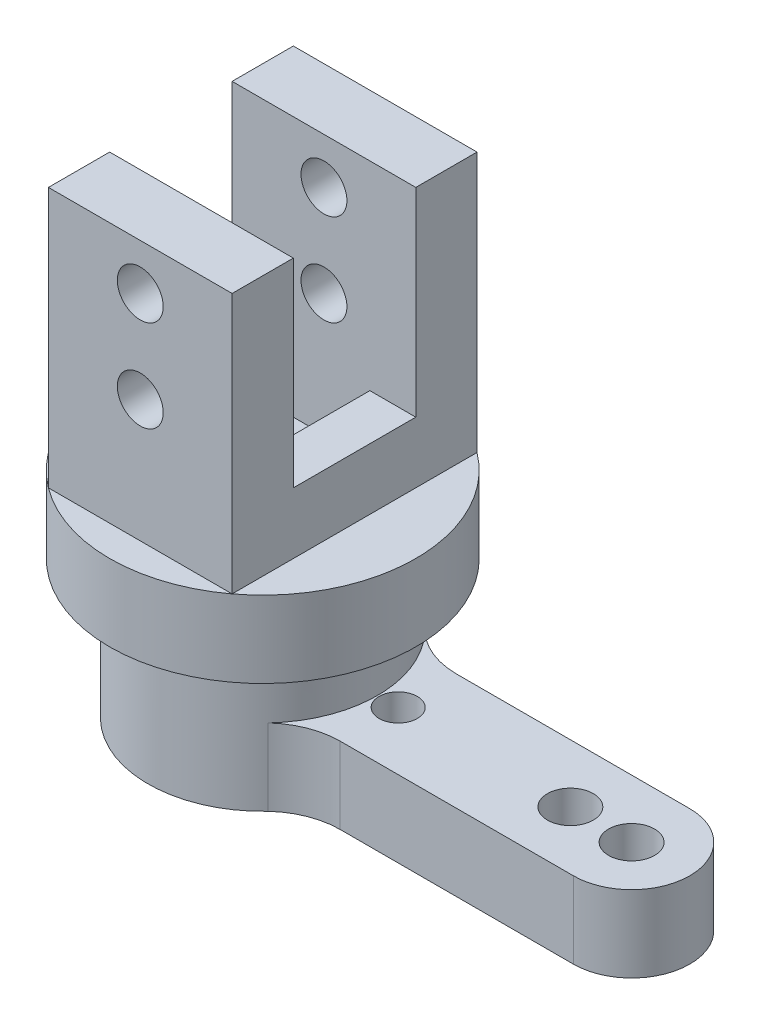
ISO-10303-21;
HEADER;
FILE_DESCRIPTION(('STEP AP214'),'2;1');
FILE_NAME('part.step','',(''),(''),'','','');
FILE_SCHEMA(('AUTOMOTIVE_DESIGN { 1 0 10303 214 1 1 1 1 }'));
ENDSEC;
DATA;
#1=APPLICATION_CONTEXT('core data for automotive mechanical design processes');
#2=APPLICATION_PROTOCOL_DEFINITION('international standard','automotive_design',2000,#1);
#3=PRODUCT_CONTEXT('',#1,'mechanical');
#4=PRODUCT('Part','Part','',(#3));
#5=PRODUCT_RELATED_PRODUCT_CATEGORY('part','',(#4));
#6=PRODUCT_DEFINITION_FORMATION('','',#4);
#7=PRODUCT_DEFINITION_CONTEXT('part definition',#1,'design');
#8=PRODUCT_DEFINITION('design','',#6,#7);
#9=PRODUCT_DEFINITION_SHAPE('','',#8);
#10=(LENGTH_UNIT() NAMED_UNIT(*) SI_UNIT(.MILLI.,.METRE.));
#11=(NAMED_UNIT(*) PLANE_ANGLE_UNIT() SI_UNIT($,.RADIAN.));
#12=(NAMED_UNIT(*) SI_UNIT($,.STERADIAN.) SOLID_ANGLE_UNIT());
#13=UNCERTAINTY_MEASURE_WITH_UNIT(LENGTH_MEASURE(1.E-05),#10,'distance_accuracy_value','');
#14=(GEOMETRIC_REPRESENTATION_CONTEXT(3) GLOBAL_UNCERTAINTY_ASSIGNED_CONTEXT((#13)) GLOBAL_UNIT_ASSIGNED_CONTEXT((#10,
#11,#12)) REPRESENTATION_CONTEXT('',''));
#15=CARTESIAN_POINT('',(0.,0.,0.));
#16=DIRECTION('',(0.,0.,1.));
#17=DIRECTION('',(1.,0.,0.));
#18=AXIS2_PLACEMENT_3D('',#15,#16,#17);
#19=CARTESIAN_POINT('',(0.,31.,8.));
#20=DIRECTION('',(0.,0.,-1.));
#21=DIRECTION('',(-1.,0.,0.));
#22=AXIS2_PLACEMENT_3D('',#19,#20,#21);
#23=PLANE('',#22);
#24=CARTESIAN_POINT('',(0.,28.,8.));
#25=DIRECTION('',(0.,0.,1.));
#26=DIRECTION('',(1.,0.,0.));
#27=AXIS2_PLACEMENT_3D('',#24,#25,#26);
#28=CIRCLE('',#27,1.5);
#29=CARTESIAN_POINT('',(1.5,28.,8.));
#30=VERTEX_POINT('',#29);
#31=EDGE_CURVE('E763',#30,#30,#28,.T.);
#32=ORIENTED_EDGE('',*,*,#31,.F.);
#33=EDGE_LOOP('',(#32));
#34=FACE_BOUND('',#33,.T.);
#35=DIRECTION('',(1.,0.,0.));
#36=VECTOR('',#35,1.);
#37=CARTESIAN_POINT('',(0.,14.,8.));
#38=LINE('',#37,#36);
#39=CARTESIAN_POINT('',(-6.,14.,8.));
#40=VERTEX_POINT('',#39);
#41=CARTESIAN_POINT('',(6.,14.,8.));
#42=VERTEX_POINT('',#41);
#43=EDGE_CURVE('E357',#40,#42,#38,.T.);
#44=ORIENTED_EDGE('',*,*,#43,.T.);
#45=DIRECTION('',(0.,-1.,0.));
#46=VECTOR('',#45,1.);
#47=CARTESIAN_POINT('',(6.,31.,8.));
#48=LINE('',#47,#46);
#49=CARTESIAN_POINT('',(6.,31.,8.));
#50=VERTEX_POINT('',#49);
#51=EDGE_CURVE('E187',#50,#42,#48,.T.);
#52=ORIENTED_EDGE('',*,*,#51,.F.);
#53=DIRECTION('',(1.,0.,0.));
#54=VECTOR('',#53,1.);
#55=CARTESIAN_POINT('',(0.,31.,8.));
#56=LINE('',#55,#54);
#57=CARTESIAN_POINT('',(-6.,31.,8.));
#58=VERTEX_POINT('',#57);
#59=EDGE_CURVE('E350',#58,#50,#56,.T.);
#60=ORIENTED_EDGE('',*,*,#59,.F.);
#61=DIRECTION('',(0.,-1.,0.));
#62=VECTOR('',#61,1.);
#63=CARTESIAN_POINT('',(-6.,31.,8.));
#64=LINE('',#63,#62);
#65=EDGE_CURVE('E191',#58,#40,#64,.T.);
#66=ORIENTED_EDGE('',*,*,#65,.T.);
#67=EDGE_LOOP('',(#44,#52,#60,#66));
#68=FACE_BOUND('',#67,.T.);
#69=CARTESIAN_POINT('',(0.,22.,8.));
#70=DIRECTION('',(0.,0.,1.));
#71=DIRECTION('',(1.,0.,0.));
#72=AXIS2_PLACEMENT_3D('',#69,#70,#71);
#73=CIRCLE('',#72,1.5);
#74=CARTESIAN_POINT('',(1.5,22.,8.));
#75=VERTEX_POINT('',#74);
#76=EDGE_CURVE('E280',#75,#75,#73,.T.);
#77=ORIENTED_EDGE('',*,*,#76,.F.);
#78=EDGE_LOOP('',(#77));
#79=FACE_BOUND('',#78,.T.);
#80=ADVANCED_FACE('F34',(#34,#68,#79),#23,.F.);
#81=CARTESIAN_POINT('',(0.,14.,0.));
#82=DIRECTION('',(0.,1.,0.));
#83=DIRECTION('',(0.,0.,1.));
#84=AXIS2_PLACEMENT_3D('',#81,#82,#83);
#85=PLANE('',#84);
#86=CARTESIAN_POINT('',(0.,14.,0.));
#87=DIRECTION('',(0.,1.,0.));
#88=DIRECTION('',(0.,0.,1.));
#89=AXIS2_PLACEMENT_3D('',#86,#87,#88);
#90=CIRCLE('',#89,1.5);
#91=CARTESIAN_POINT('',(0.,14.,1.5));
#92=VERTEX_POINT('',#91);
#93=EDGE_CURVE('E199',#92,#92,#90,.T.);
#94=ORIENTED_EDGE('',*,*,#93,.F.);
#95=EDGE_LOOP('',(#94));
#96=FACE_BOUND('',#95,.T.);
#97=DIRECTION('',(-1.,0.,0.));
#98=VECTOR('',#97,1.);
#99=CARTESIAN_POINT('',(0.,14.,-4.));
#100=LINE('',#99,#98);
#101=CARTESIAN_POINT('',(3.,14.,-4.));
#102=VERTEX_POINT('',#101);
#103=CARTESIAN_POINT('',(-3.,14.,-4.));
#104=VERTEX_POINT('',#103);
#105=EDGE_CURVE('E321',#102,#104,#100,.T.);
#106=ORIENTED_EDGE('',*,*,#105,.T.);
#107=DIRECTION('',(0.,0.,-1.));
#108=VECTOR('',#107,1.);
#109=CARTESIAN_POINT('',(-3.,14.,-4.));
#110=LINE('',#109,#108);
#111=CARTESIAN_POINT('',(-3.,14.,4.));
#112=VERTEX_POINT('',#111);
#113=EDGE_CURVE('E59',#112,#104,#110,.T.);
#114=ORIENTED_EDGE('',*,*,#113,.F.);
#115=DIRECTION('',(-1.,0.,0.));
#116=VECTOR('',#115,1.);
#117=CARTESIAN_POINT('',(0.,14.,4.));
#118=LINE('',#117,#116);
#119=CARTESIAN_POINT('',(3.,14.,4.));
#120=VERTEX_POINT('',#119);
#121=EDGE_CURVE('E351',#120,#112,#118,.T.);
#122=ORIENTED_EDGE('',*,*,#121,.F.);
#123=DIRECTION('',(0.,0.,1.));
#124=VECTOR('',#123,1.);
#125=CARTESIAN_POINT('',(3.,14.,-4.));
#126=LINE('',#125,#124);
#127=EDGE_CURVE('E182',#102,#120,#126,.T.);
#128=ORIENTED_EDGE('',*,*,#127,.F.);
#129=EDGE_LOOP('',(#106,#114,#122,#128));
#130=FACE_BOUND('',#129,.T.);
#131=ADVANCED_FACE('F407',(#96,#130),#85,.T.);
#132=DIRECTION('',(0.,0.,-1.));
#133=VECTOR('',#132,1.);
#134=CARTESIAN_POINT('',(-6.,14.,0.));
#135=LINE('',#134,#133);
#136=CARTESIAN_POINT('',(-6.,14.,-8.));
#137=VERTEX_POINT('',#136);
#138=EDGE_CURVE('E346',#40,#137,#135,.T.);
#139=ORIENTED_EDGE('',*,*,#138,.T.);
#140=CARTESIAN_POINT('',(0.,14.,0.));
#141=DIRECTION('',(0.,1.,0.));
#142=DIRECTION('',(0.,0.,1.));
#143=AXIS2_PLACEMENT_3D('',#140,#141,#142);
#144=CIRCLE('',#143,10.);
#145=EDGE_CURVE('E211',#137,#40,#144,.T.);
#146=ORIENTED_EDGE('',*,*,#145,.T.);
#147=EDGE_LOOP('',(#139,#146));
#148=FACE_BOUND('',#147,.T.);
#149=ADVANCED_FACE('F409',(#148),#85,.T.);
#150=CARTESIAN_POINT('',(0.,31.,4.));
#151=DIRECTION('',(0.,0.,1.));
#152=DIRECTION('',(1.,0.,0.));
#153=AXIS2_PLACEMENT_3D('',#150,#151,#152);
#154=PLANE('',#153);
#155=CARTESIAN_POINT('',(0.,28.,4.));
#156=DIRECTION('',(0.,0.,1.));
#157=DIRECTION('',(1.,0.,0.));
#158=AXIS2_PLACEMENT_3D('',#155,#156,#157);
#159=CIRCLE('',#158,1.5);
#160=CARTESIAN_POINT('',(1.5,28.,4.));
#161=VERTEX_POINT('',#160);
#162=EDGE_CURVE('E287',#161,#161,#159,.T.);
#163=ORIENTED_EDGE('',*,*,#162,.T.);
#164=EDGE_LOOP('',(#163));
#165=FACE_BOUND('',#164,.T.);
#166=CARTESIAN_POINT('',(0.,22.,4.));
#167=DIRECTION('',(0.,0.,1.));
#168=DIRECTION('',(1.,0.,0.));
#169=AXIS2_PLACEMENT_3D('',#166,#167,#168);
#170=CIRCLE('',#169,1.5);
#171=CARTESIAN_POINT('',(1.5,22.,4.));
#172=VERTEX_POINT('',#171);
#173=EDGE_CURVE('E284',#172,#172,#170,.T.);
#174=ORIENTED_EDGE('',*,*,#173,.T.);
#175=EDGE_LOOP('',(#174));
#176=FACE_BOUND('',#175,.T.);
#177=DIRECTION('',(0.,-1.,0.));
#178=VECTOR('',#177,1.);
#179=CARTESIAN_POINT('',(-3.,18.,4.));
#180=LINE('',#179,#178);
#181=CARTESIAN_POINT('',(-3.,18.,4.));
#182=VERTEX_POINT('',#181);
#183=EDGE_CURVE('E51',#182,#112,#180,.T.);
#184=ORIENTED_EDGE('',*,*,#183,.F.);
#185=DIRECTION('',(1.,0.,0.));
#186=VECTOR('',#185,1.);
#187=CARTESIAN_POINT('',(-6.,18.,4.));
#188=LINE('',#187,#186);
#189=CARTESIAN_POINT('',(-6.,18.,4.));
#190=VERTEX_POINT('',#189);
#191=EDGE_CURVE('E298',#190,#182,#188,.T.);
#192=ORIENTED_EDGE('',*,*,#191,.F.);
#193=DIRECTION('',(0.,-1.,0.));
#194=VECTOR('',#193,1.);
#195=CARTESIAN_POINT('',(-6.,31.,4.));
#196=LINE('',#195,#194);
#197=CARTESIAN_POINT('',(-6.,31.,4.));
#198=VERTEX_POINT('',#197);
#199=EDGE_CURVE('E188',#198,#190,#196,.T.);
#200=ORIENTED_EDGE('',*,*,#199,.F.);
#201=DIRECTION('',(-1.,0.,0.));
#202=VECTOR('',#201,1.);
#203=CARTESIAN_POINT('',(0.,31.,4.));
#204=LINE('',#203,#202);
#205=CARTESIAN_POINT('',(6.,31.,4.));
#206=VERTEX_POINT('',#205);
#207=EDGE_CURVE('E186',#206,#198,#204,.T.);
#208=ORIENTED_EDGE('',*,*,#207,.F.);
#209=DIRECTION('',(0.,-1.,0.));
#210=VECTOR('',#209,1.);
#211=CARTESIAN_POINT('',(6.,31.,4.));
#212=LINE('',#211,#210);
#213=CARTESIAN_POINT('',(6.,18.,4.));
#214=VERTEX_POINT('',#213);
#215=EDGE_CURVE('E167',#206,#214,#212,.T.);
#216=ORIENTED_EDGE('',*,*,#215,.T.);
#217=DIRECTION('',(1.,0.,0.));
#218=VECTOR('',#217,1.);
#219=CARTESIAN_POINT('',(6.,18.,4.));
#220=LINE('',#219,#218);
#221=CARTESIAN_POINT('',(3.,18.,4.));
#222=VERTEX_POINT('',#221);
#223=EDGE_CURVE('E174',#222,#214,#220,.T.);
#224=ORIENTED_EDGE('',*,*,#223,.F.);
#225=DIRECTION('',(0.,-1.,0.));
#226=VECTOR('',#225,1.);
#227=CARTESIAN_POINT('',(3.,18.,4.));
#228=LINE('',#227,#226);
#229=EDGE_CURVE('E316',#222,#120,#228,.T.);
#230=ORIENTED_EDGE('',*,*,#229,.T.);
#231=ORIENTED_EDGE('',*,*,#121,.T.);
#232=EDGE_LOOP('',(#184,#192,#200,#208,#216,#224,#230,#231));
#233=FACE_BOUND('',#232,.T.);
#234=ADVANCED_FACE('F184',(#165,#176,#233),#154,.F.);
#235=CARTESIAN_POINT('',(0.,31.,-4.));
#236=DIRECTION('',(0.,0.,1.));
#237=DIRECTION('',(1.,0.,0.));
#238=AXIS2_PLACEMENT_3D('',#235,#236,#237);
#239=PLANE('',#238);
#240=CARTESIAN_POINT('',(0.,28.,-4.));
#241=DIRECTION('',(0.,0.,1.));
#242=DIRECTION('',(1.,0.,0.));
#243=AXIS2_PLACEMENT_3D('',#240,#241,#242);
#244=CIRCLE('',#243,1.5);
#245=CARTESIAN_POINT('',(1.5,28.,-4.));
#246=VERTEX_POINT('',#245);
#247=EDGE_CURVE('E292',#246,#246,#244,.T.);
#248=ORIENTED_EDGE('',*,*,#247,.F.);
#249=EDGE_LOOP('',(#248));
#250=FACE_BOUND('',#249,.T.);
#251=CARTESIAN_POINT('',(0.,22.,-4.));
#252=DIRECTION('',(0.,0.,1.));
#253=DIRECTION('',(1.,0.,0.));
#254=AXIS2_PLACEMENT_3D('',#251,#252,#253);
#255=CIRCLE('',#254,1.5);
#256=CARTESIAN_POINT('',(1.5,22.,-4.));
#257=VERTEX_POINT('',#256);
#258=EDGE_CURVE('E279',#257,#257,#255,.T.);
#259=ORIENTED_EDGE('',*,*,#258,.F.);
#260=EDGE_LOOP('',(#259));
#261=FACE_BOUND('',#260,.T.);
#262=DIRECTION('',(-1.,0.,0.));
#263=VECTOR('',#262,1.);
#264=CARTESIAN_POINT('',(-6.,18.,-4.));
#265=LINE('',#264,#263);
#266=CARTESIAN_POINT('',(-3.,18.,-4.));
#267=VERTEX_POINT('',#266);
#268=CARTESIAN_POINT('',(-6.,18.,-4.));
#269=VERTEX_POINT('',#268);
#270=EDGE_CURVE('E304',#267,#269,#265,.T.);
#271=ORIENTED_EDGE('',*,*,#270,.F.);
#272=DIRECTION('',(0.,-1.,0.));
#273=VECTOR('',#272,1.);
#274=CARTESIAN_POINT('',(-3.,18.,-4.));
#275=LINE('',#274,#273);
#276=EDGE_CURVE('E310',#267,#104,#275,.T.);
#277=ORIENTED_EDGE('',*,*,#276,.T.);
#278=ORIENTED_EDGE('',*,*,#105,.F.);
#279=DIRECTION('',(0.,-1.,0.));
#280=VECTOR('',#279,1.);
#281=CARTESIAN_POINT('',(3.,18.,-4.));
#282=LINE('',#281,#280);
#283=CARTESIAN_POINT('',(3.,18.,-4.));
#284=VERTEX_POINT('',#283);
#285=EDGE_CURVE('E319',#284,#102,#282,.T.);
#286=ORIENTED_EDGE('',*,*,#285,.F.);
#287=DIRECTION('',(-1.,0.,0.));
#288=VECTOR('',#287,1.);
#289=CARTESIAN_POINT('',(6.,18.,-4.));
#290=LINE('',#289,#288);
#291=CARTESIAN_POINT('',(6.,18.,-4.));
#292=VERTEX_POINT('',#291);
#293=EDGE_CURVE('E173',#292,#284,#290,.T.);
#294=ORIENTED_EDGE('',*,*,#293,.F.);
#295=DIRECTION('',(0.,-1.,0.));
#296=VECTOR('',#295,1.);
#297=CARTESIAN_POINT('',(6.,31.,-4.));
#298=LINE('',#297,#296);
#299=CARTESIAN_POINT('',(6.,31.,-4.));
#300=VERTEX_POINT('',#299);
#301=EDGE_CURVE('E170',#300,#292,#298,.T.);
#302=ORIENTED_EDGE('',*,*,#301,.F.);
#303=DIRECTION('',(-1.,0.,0.));
#304=VECTOR('',#303,1.);
#305=CARTESIAN_POINT('',(0.,31.,-4.));
#306=LINE('',#305,#304);
#307=CARTESIAN_POINT('',(-6.,31.,-4.));
#308=VERTEX_POINT('',#307);
#309=EDGE_CURVE('E322',#300,#308,#306,.T.);
#310=ORIENTED_EDGE('',*,*,#309,.T.);
#311=DIRECTION('',(0.,-1.,0.));
#312=VECTOR('',#311,1.);
#313=CARTESIAN_POINT('',(-6.,31.,-4.));
#314=LINE('',#313,#312);
#315=EDGE_CURVE('E334',#308,#269,#314,.T.);
#316=ORIENTED_EDGE('',*,*,#315,.T.);
#317=EDGE_LOOP('',(#271,#277,#278,#286,#294,#302,#310,#316));
#318=FACE_BOUND('',#317,.T.);
#319=ADVANCED_FACE('F402',(#250,#261,#318),#239,.T.);
#320=CARTESIAN_POINT('',(6.,14.,-8.));
#321=VERTEX_POINT('',#320);
#322=EDGE_CURVE('E206',#42,#321,#144,.T.);
#323=ORIENTED_EDGE('',*,*,#322,.T.);
#324=DIRECTION('',(0.,0.,-1.));
#325=VECTOR('',#324,1.);
#326=CARTESIAN_POINT('',(6.,14.,0.));
#327=LINE('',#326,#325);
#328=EDGE_CURVE('E360',#42,#321,#327,.T.);
#329=ORIENTED_EDGE('',*,*,#328,.F.);
#330=EDGE_LOOP('',(#323,#329));
#331=FACE_BOUND('',#330,.T.);
#332=ADVANCED_FACE('F417',(#331),#85,.T.);
#333=DIRECTION('',(1.,0.,0.));
#334=VECTOR('',#333,1.);
#335=CARTESIAN_POINT('',(0.,14.,-8.));
#336=LINE('',#335,#334);
#337=EDGE_CURVE('E326',#137,#321,#336,.T.);
#338=ORIENTED_EDGE('',*,*,#337,.T.);
#339=EDGE_CURVE('E210',#321,#137,#144,.T.);
#340=ORIENTED_EDGE('',*,*,#339,.T.);
#341=EDGE_LOOP('',(#338,#340));
#342=FACE_BOUND('',#341,.T.);
#343=ADVANCED_FACE('F391',(#342),#85,.T.);
#344=CARTESIAN_POINT('',(0.,5.,-3.8));
#345=DIRECTION('',(0.,0.,-1.));
#346=DIRECTION('',(-1.,0.,0.));
#347=AXIS2_PLACEMENT_3D('',#344,#345,#346);
#348=PLANE('',#347);
#349=DIRECTION('',(1.,0.,0.));
#350=VECTOR('',#349,1.);
#351=CARTESIAN_POINT('',(0.,0.,-3.8));
#352=LINE('',#351,#350);
#353=CARTESIAN_POINT('',(8.85,0.,-3.8));
#354=VERTEX_POINT('',#353);
#355=CARTESIAN_POINT('',(24.1,0.,-3.8));
#356=VERTEX_POINT('',#355);
#357=EDGE_CURVE('E218',#354,#356,#352,.T.);
#358=ORIENTED_EDGE('',*,*,#357,.F.);
#359=DIRECTION('',(0.,-1.,0.));
#360=VECTOR('',#359,1.);
#361=CARTESIAN_POINT('',(8.85,5.,-3.8));
#362=LINE('',#361,#360);
#363=CARTESIAN_POINT('',(8.85,5.,-3.8));
#364=VERTEX_POINT('',#363);
#365=EDGE_CURVE('E11',#364,#354,#362,.T.);
#366=ORIENTED_EDGE('',*,*,#365,.F.);
#367=DIRECTION('',(1.,0.,0.));
#368=VECTOR('',#367,1.);
#369=CARTESIAN_POINT('',(0.,5.,-3.8));
#370=LINE('',#369,#368);
#371=CARTESIAN_POINT('',(24.1,5.,-3.8));
#372=VERTEX_POINT('',#371);
#373=EDGE_CURVE('E221',#364,#372,#370,.T.);
#374=ORIENTED_EDGE('',*,*,#373,.T.);
#375=DIRECTION('',(0.,-1.,0.));
#376=VECTOR('',#375,1.);
#377=CARTESIAN_POINT('',(24.1,5.,-3.8));
#378=LINE('',#377,#376);
#379=EDGE_CURVE('E244',#372,#356,#378,.T.);
#380=ORIENTED_EDGE('',*,*,#379,.T.);
#381=EDGE_LOOP('',(#358,#366,#374,#380));
#382=FACE_BOUND('',#381,.T.);
#383=ADVANCED_FACE('F36',(#382),#348,.T.);
#384=CARTESIAN_POINT('',(8.86734981225492,5.,-8.79996989831086));
#385=DIRECTION('',(0.,-1.,0.));
#386=DIRECTION('',(0.,0.,-1.));
#387=AXIS2_PLACEMENT_3D('',#384,#385,#386);
#388=CYLINDRICAL_SURFACE('',#387,5.);
#389=CARTESIAN_POINT('',(8.86734981225492,0.,-8.79996989831086));
#390=DIRECTION('',(0.,1.,0.));
#391=DIRECTION('',(0.,0.,1.));
#392=AXIS2_PLACEMENT_3D('',#389,#390,#391);
#393=CIRCLE('',#392,5.);
#394=CARTESIAN_POINT('',(5.46809934773638,0.,-5.1332143461271));
#395=VERTEX_POINT('',#394);
#396=EDGE_CURVE('E247',#395,#354,#393,.T.);
#397=ORIENTED_EDGE('',*,*,#396,.F.);
#398=DIRECTION('',(0.,-1.,0.));
#399=VECTOR('',#398,1.);
#400=CARTESIAN_POINT('',(5.46809934773638,5.,-5.1332143461271));
#401=LINE('',#400,#399);
#402=CARTESIAN_POINT('',(5.46809934773638,5.,-5.1332143461271));
#403=VERTEX_POINT('',#402);
#404=EDGE_CURVE('E43',#403,#395,#401,.T.);
#405=ORIENTED_EDGE('',*,*,#404,.F.);
#406=CARTESIAN_POINT('',(8.86734981225492,5.,-8.79996989831086));
#407=DIRECTION('',(0.,1.,0.));
#408=DIRECTION('',(0.,0.,1.));
#409=AXIS2_PLACEMENT_3D('',#406,#407,#408);
#410=CIRCLE('',#409,5.);
#411=EDGE_CURVE('E224',#403,#364,#410,.T.);
#412=ORIENTED_EDGE('',*,*,#411,.T.);
#413=ORIENTED_EDGE('',*,*,#365,.T.);
#414=EDGE_LOOP('',(#397,#405,#412,#413));
#415=FACE_BOUND('',#414,.T.);
#416=ADVANCED_FACE('F438',(#415),#388,.F.);
#417=CARTESIAN_POINT('',(0.,5.,0.));
#418=DIRECTION('',(0.,-1.,0.));
#419=DIRECTION('',(0.,0.,-1.));
#420=AXIS2_PLACEMENT_3D('',#417,#418,#419);
#421=CYLINDRICAL_SURFACE('',#420,7.5);
#422=CARTESIAN_POINT('',(0.,0.,0.));
#423=DIRECTION('',(0.,1.,0.));
#424=DIRECTION('',(0.,0.,1.));
#425=AXIS2_PLACEMENT_3D('',#422,#423,#424);
#426=CIRCLE('',#425,7.5);
#427=CARTESIAN_POINT('',(5.46809934773638,0.,5.1332143461271));
#428=VERTEX_POINT('',#427);
#429=EDGE_CURVE('E250',#395,#428,#426,.T.);
#430=ORIENTED_EDGE('',*,*,#429,.T.);
#431=DIRECTION('',(0.,-1.,0.));
#432=VECTOR('',#431,1.);
#433=CARTESIAN_POINT('',(5.46809934773638,5.,5.1332143461271));
#434=LINE('',#433,#432);
#435=CARTESIAN_POINT('',(5.46809934773638,5.,5.1332143461271));
#436=VERTEX_POINT('',#435);
#437=EDGE_CURVE('E274',#436,#428,#434,.T.);
#438=ORIENTED_EDGE('',*,*,#437,.F.);
#439=CARTESIAN_POINT('',(0.,5.,0.));
#440=DIRECTION('',(0.,1.,0.));
#441=DIRECTION('',(0.,0.,1.));
#442=AXIS2_PLACEMENT_3D('',#439,#440,#441);
#443=CIRCLE('',#442,7.5);
#444=EDGE_CURVE('E209',#436,#403,#443,.T.);
#445=ORIENTED_EDGE('',*,*,#444,.T.);
#446=ORIENTED_EDGE('',*,*,#404,.T.);
#447=EDGE_LOOP('',(#430,#438,#445,#446));
#448=FACE_BOUND('',#447,.T.);
#449=CARTESIAN_POINT('',(0.,9.,0.));
#450=DIRECTION('',(0.,1.,0.));
#451=DIRECTION('',(0.,0.,1.));
#452=AXIS2_PLACEMENT_3D('',#449,#450,#451);
#453=CIRCLE('',#452,7.5);
#454=CARTESIAN_POINT('',(0.,9.,7.5));
#455=VERTEX_POINT('',#454);
#456=EDGE_CURVE('E215',#455,#455,#453,.T.);
#457=ORIENTED_EDGE('',*,*,#456,.F.);
#458=EDGE_LOOP('',(#457));
#459=FACE_BOUND('',#458,.T.);
#460=ADVANCED_FACE('F510',(#448,#459),#421,.T.);
#461=CARTESIAN_POINT('',(8.86734981225492,5.,8.79996989831086));
#462=DIRECTION('',(0.,-1.,0.));
#463=DIRECTION('',(0.,0.,-1.));
#464=AXIS2_PLACEMENT_3D('',#461,#462,#463);
#465=CYLINDRICAL_SURFACE('',#464,5.);
#466=CARTESIAN_POINT('',(8.86734981225492,0.,8.79996989831086));
#467=DIRECTION('',(0.,1.,0.));
#468=DIRECTION('',(0.,0.,1.));
#469=AXIS2_PLACEMENT_3D('',#466,#467,#468);
#470=CIRCLE('',#469,5.);
#471=CARTESIAN_POINT('',(8.85,0.,3.8));
#472=VERTEX_POINT('',#471);
#473=EDGE_CURVE('E252',#428,#472,#470,.F.);
#474=ORIENTED_EDGE('',*,*,#473,.T.);
#475=DIRECTION('',(0.,-1.,0.));
#476=VECTOR('',#475,1.);
#477=CARTESIAN_POINT('',(8.85,5.,3.8));
#478=LINE('',#477,#476);
#479=CARTESIAN_POINT('',(8.85,5.,3.8));
#480=VERTEX_POINT('',#479);
#481=EDGE_CURVE('E271',#480,#472,#478,.T.);
#482=ORIENTED_EDGE('',*,*,#481,.F.);
#483=CARTESIAN_POINT('',(8.86734981225492,5.,8.79996989831086));
#484=DIRECTION('',(0.,1.,0.));
#485=DIRECTION('',(0.,0.,1.));
#486=AXIS2_PLACEMENT_3D('',#483,#484,#485);
#487=CIRCLE('',#486,5.);
#488=EDGE_CURVE('E228',#436,#480,#487,.F.);
#489=ORIENTED_EDGE('',*,*,#488,.F.);
#490=ORIENTED_EDGE('',*,*,#437,.T.);
#491=EDGE_LOOP('',(#474,#482,#489,#490));
#492=FACE_BOUND('',#491,.T.);
#493=ADVANCED_FACE('F506',(#492),#465,.F.);
#494=CARTESIAN_POINT('',(0.,5.,3.8));
#495=DIRECTION('',(0.,0.,-1.));
#496=DIRECTION('',(-1.,0.,0.));
#497=AXIS2_PLACEMENT_3D('',#494,#495,#496);
#498=PLANE('',#497);
#499=DIRECTION('',(1.,0.,0.));
#500=VECTOR('',#499,1.);
#501=CARTESIAN_POINT('',(0.,0.,3.8));
#502=LINE('',#501,#500);
#503=CARTESIAN_POINT('',(24.1,0.,3.8));
#504=VERTEX_POINT('',#503);
#505=EDGE_CURVE('E254',#472,#504,#502,.T.);
#506=ORIENTED_EDGE('',*,*,#505,.T.);
#507=DIRECTION('',(0.,-1.,0.));
#508=VECTOR('',#507,1.);
#509=CARTESIAN_POINT('',(24.1,5.,3.8));
#510=LINE('',#509,#508);
#511=CARTESIAN_POINT('',(24.1,5.,3.8));
#512=VERTEX_POINT('',#511);
#513=EDGE_CURVE('E269',#512,#504,#510,.T.);
#514=ORIENTED_EDGE('',*,*,#513,.F.);
#515=DIRECTION('',(1.,0.,0.));
#516=VECTOR('',#515,1.);
#517=CARTESIAN_POINT('',(0.,5.,3.8));
#518=LINE('',#517,#516);
#519=EDGE_CURVE('E230',#480,#512,#518,.T.);
#520=ORIENTED_EDGE('',*,*,#519,.F.);
#521=ORIENTED_EDGE('',*,*,#481,.T.);
#522=EDGE_LOOP('',(#506,#514,#520,#521));
#523=FACE_BOUND('',#522,.T.);
#524=ADVANCED_FACE('F499',(#523),#498,.F.);
#525=CARTESIAN_POINT('',(24.1,5.,0.));
#526=DIRECTION('',(0.,-1.,0.));
#527=DIRECTION('',(0.,0.,-1.));
#528=AXIS2_PLACEMENT_3D('',#525,#526,#527);
#529=CYLINDRICAL_SURFACE('',#528,1.5);
#530=CARTESIAN_POINT('',(24.1,5.,0.));
#531=DIRECTION('',(0.,1.,0.));
#532=DIRECTION('',(0.,0.,1.));
#533=AXIS2_PLACEMENT_3D('',#530,#531,#532);
#534=CIRCLE('',#533,1.5);
#535=CARTESIAN_POINT('',(24.1,5.,1.5));
#536=VERTEX_POINT('',#535);
#537=EDGE_CURVE('E238',#536,#536,#534,.T.);
#538=ORIENTED_EDGE('',*,*,#537,.T.);
#539=EDGE_LOOP('',(#538));
#540=FACE_BOUND('',#539,.T.);
#541=CARTESIAN_POINT('',(24.1,0.,0.));
#542=DIRECTION('',(0.,1.,0.));
#543=DIRECTION('',(0.,0.,1.));
#544=AXIS2_PLACEMENT_3D('',#541,#542,#543);
#545=CIRCLE('',#544,1.5);
#546=CARTESIAN_POINT('',(24.1,0.,1.5));
#547=VERTEX_POINT('',#546);
#548=EDGE_CURVE('E263',#547,#547,#545,.T.);
#549=ORIENTED_EDGE('',*,*,#548,.F.);
#550=EDGE_LOOP('',(#549));
#551=FACE_BOUND('',#550,.T.);
#552=ADVANCED_FACE('F496',(#540,#551),#529,.F.);
#553=CARTESIAN_POINT('',(8.85,5.,0.));
#554=DIRECTION('',(0.,-1.,0.));
#555=DIRECTION('',(0.,0.,-1.));
#556=AXIS2_PLACEMENT_3D('',#553,#554,#555);
#557=CYLINDRICAL_SURFACE('',#556,1.25);
#558=CARTESIAN_POINT('',(8.85,5.,0.));
#559=DIRECTION('',(0.,1.,0.));
#560=DIRECTION('',(0.,0.,1.));
#561=AXIS2_PLACEMENT_3D('',#558,#559,#560);
#562=CIRCLE('',#561,1.25);
#563=CARTESIAN_POINT('',(8.85,5.,1.25));
#564=VERTEX_POINT('',#563);
#565=EDGE_CURVE('E235',#564,#564,#562,.T.);
#566=ORIENTED_EDGE('',*,*,#565,.T.);
#567=EDGE_LOOP('',(#566));
#568=FACE_BOUND('',#567,.T.);
#569=CARTESIAN_POINT('',(8.85,0.,0.));
#570=DIRECTION('',(0.,1.,0.));
#571=DIRECTION('',(0.,0.,1.));
#572=AXIS2_PLACEMENT_3D('',#569,#570,#571);
#573=CIRCLE('',#572,1.25);
#574=CARTESIAN_POINT('',(8.85,0.,1.25));
#575=VERTEX_POINT('',#574);
#576=EDGE_CURVE('E260',#575,#575,#573,.T.);
#577=ORIENTED_EDGE('',*,*,#576,.F.);
#578=EDGE_LOOP('',(#577));
#579=FACE_BOUND('',#578,.T.);
#580=ADVANCED_FACE('F492',(#568,#579),#557,.F.);
#581=CARTESIAN_POINT('',(24.1,5.,0.));
#582=DIRECTION('',(0.,-1.,0.));
#583=DIRECTION('',(0.,0.,-1.));
#584=AXIS2_PLACEMENT_3D('',#581,#582,#583);
#585=CYLINDRICAL_SURFACE('',#584,3.8);
#586=CARTESIAN_POINT('',(24.1,0.,0.));
#587=DIRECTION('',(0.,1.,0.));
#588=DIRECTION('',(0.,0.,1.));
#589=AXIS2_PLACEMENT_3D('',#586,#587,#588);
#590=CIRCLE('',#589,3.8);
#591=EDGE_CURVE('E257',#356,#504,#590,.F.);
#592=ORIENTED_EDGE('',*,*,#591,.F.);
#593=ORIENTED_EDGE('',*,*,#379,.F.);
#594=CARTESIAN_POINT('',(24.1,5.,0.));
#595=DIRECTION('',(0.,1.,0.));
#596=DIRECTION('',(0.,0.,1.));
#597=AXIS2_PLACEMENT_3D('',#594,#595,#596);
#598=CIRCLE('',#597,3.8);
#599=EDGE_CURVE('E232',#372,#512,#598,.F.);
#600=ORIENTED_EDGE('',*,*,#599,.T.);
#601=ORIENTED_EDGE('',*,*,#513,.T.);
#602=EDGE_LOOP('',(#592,#593,#600,#601));
#603=FACE_BOUND('',#602,.T.);
#604=ADVANCED_FACE('F483',(#603),#585,.T.);
#605=CARTESIAN_POINT('',(20.1,5.,0.));
#606=DIRECTION('',(0.,-1.,0.));
#607=DIRECTION('',(0.,0.,-1.));
#608=AXIS2_PLACEMENT_3D('',#605,#606,#607);
#609=CYLINDRICAL_SURFACE('',#608,1.5);
#610=CARTESIAN_POINT('',(20.1,5.,0.));
#611=DIRECTION('',(0.,1.,0.));
#612=DIRECTION('',(0.,0.,1.));
#613=AXIS2_PLACEMENT_3D('',#610,#611,#612);
#614=CIRCLE('',#613,1.5);
#615=CARTESIAN_POINT('',(20.1,5.,1.5));
#616=VERTEX_POINT('',#615);
#617=EDGE_CURVE('E241',#616,#616,#614,.T.);
#618=ORIENTED_EDGE('',*,*,#617,.T.);
#619=EDGE_LOOP('',(#618));
#620=FACE_BOUND('',#619,.T.);
#621=CARTESIAN_POINT('',(20.1,0.,0.));
#622=DIRECTION('',(0.,1.,0.));
#623=DIRECTION('',(0.,0.,1.));
#624=AXIS2_PLACEMENT_3D('',#621,#622,#623);
#625=CIRCLE('',#624,1.5);
#626=CARTESIAN_POINT('',(20.1,0.,1.5));
#627=VERTEX_POINT('',#626);
#628=EDGE_CURVE('E225',#627,#627,#625,.T.);
#629=ORIENTED_EDGE('',*,*,#628,.F.);
#630=EDGE_LOOP('',(#629));
#631=FACE_BOUND('',#630,.T.);
#632=ADVANCED_FACE('F481',(#620,#631),#609,.F.);
#633=CARTESIAN_POINT('',(0.,5.,0.));
#634=DIRECTION('',(0.,1.,0.));
#635=DIRECTION('',(0.,0.,1.));
#636=AXIS2_PLACEMENT_3D('',#633,#634,#635);
#637=PLANE('',#636);
#638=ORIENTED_EDGE('',*,*,#444,.F.);
#639=ORIENTED_EDGE('',*,*,#488,.T.);
#640=ORIENTED_EDGE('',*,*,#519,.T.);
#641=ORIENTED_EDGE('',*,*,#599,.F.);
#642=ORIENTED_EDGE('',*,*,#373,.F.);
#643=ORIENTED_EDGE('',*,*,#411,.F.);
#644=EDGE_LOOP('',(#638,#639,#640,#641,#642,#643));
#645=FACE_BOUND('',#644,.T.);
#646=ORIENTED_EDGE('',*,*,#565,.F.);
#647=EDGE_LOOP('',(#646));
#648=FACE_BOUND('',#647,.T.);
#649=ORIENTED_EDGE('',*,*,#537,.F.);
#650=EDGE_LOOP('',(#649));
#651=FACE_BOUND('',#650,.T.);
#652=ORIENTED_EDGE('',*,*,#617,.F.);
#653=EDGE_LOOP('',(#652));
#654=FACE_BOUND('',#653,.T.);
#655=ADVANCED_FACE('F470',(#645,#648,#651,#654),#637,.T.);
#656=CARTESIAN_POINT('',(0.,0.,0.));
#657=DIRECTION('',(0.,1.,0.));
#658=DIRECTION('',(0.,0.,1.));
#659=AXIS2_PLACEMENT_3D('',#656,#657,#658);
#660=PLANE('',#659);
#661=CARTESIAN_POINT('',(0.,0.,0.));
#662=DIRECTION('',(0.,1.,0.));
#663=DIRECTION('',(0.,0.,1.));
#664=AXIS2_PLACEMENT_3D('',#661,#662,#663);
#665=CIRCLE('',#664,1.5);
#666=CARTESIAN_POINT('',(0.,0.,1.5));
#667=VERTEX_POINT('',#666);
#668=EDGE_CURVE('E200',#667,#667,#665,.T.);
#669=ORIENTED_EDGE('',*,*,#668,.T.);
#670=EDGE_LOOP('',(#669));
#671=FACE_BOUND('',#670,.T.);
#672=ORIENTED_EDGE('',*,*,#357,.T.);
#673=ORIENTED_EDGE('',*,*,#591,.T.);
#674=ORIENTED_EDGE('',*,*,#505,.F.);
#675=ORIENTED_EDGE('',*,*,#473,.F.);
#676=ORIENTED_EDGE('',*,*,#429,.F.);
#677=ORIENTED_EDGE('',*,*,#396,.T.);
#678=EDGE_LOOP('',(#672,#673,#674,#675,#676,#677));
#679=FACE_BOUND('',#678,.T.);
#680=ORIENTED_EDGE('',*,*,#576,.T.);
#681=EDGE_LOOP('',(#680));
#682=FACE_BOUND('',#681,.T.);
#683=ORIENTED_EDGE('',*,*,#548,.T.);
#684=EDGE_LOOP('',(#683));
#685=FACE_BOUND('',#684,.T.);
#686=ORIENTED_EDGE('',*,*,#628,.T.);
#687=EDGE_LOOP('',(#686));
#688=FACE_BOUND('',#687,.T.);
#689=ADVANCED_FACE('F431',(#671,#679,#682,#685,#688),#660,.F.);
#690=CARTESIAN_POINT('',(0.,14.,0.));
#691=DIRECTION('',(0.,-1.,0.));
#692=DIRECTION('',(0.,0.,-1.));
#693=AXIS2_PLACEMENT_3D('',#690,#691,#692);
#694=CYLINDRICAL_SURFACE('',#693,10.);
#695=ORIENTED_EDGE('',*,*,#322,.F.);
#696=EDGE_CURVE('E212',#40,#42,#144,.T.);
#697=ORIENTED_EDGE('',*,*,#696,.F.);
#698=ORIENTED_EDGE('',*,*,#145,.F.);
#699=ORIENTED_EDGE('',*,*,#339,.F.);
#700=EDGE_LOOP('',(#695,#697,#698,#699));
#701=FACE_BOUND('',#700,.T.);
#702=CARTESIAN_POINT('',(0.,9.,0.));
#703=DIRECTION('',(0.,1.,0.));
#704=DIRECTION('',(0.,0.,1.));
#705=AXIS2_PLACEMENT_3D('',#702,#703,#704);
#706=CIRCLE('',#705,10.);
#707=CARTESIAN_POINT('',(0.,9.,10.));
#708=VERTEX_POINT('',#707);
#709=EDGE_CURVE('E203',#708,#708,#706,.T.);
#710=ORIENTED_EDGE('',*,*,#709,.T.);
#711=EDGE_LOOP('',(#710));
#712=FACE_BOUND('',#711,.T.);
#713=ADVANCED_FACE('F386',(#701,#712),#694,.T.);
#714=ORIENTED_EDGE('',*,*,#43,.F.);
#715=ORIENTED_EDGE('',*,*,#696,.T.);
#716=EDGE_LOOP('',(#714,#715));
#717=FACE_BOUND('',#716,.T.);
#718=ADVANCED_FACE('F383',(#717),#85,.T.);
#719=CARTESIAN_POINT('',(0.,9.,0.));
#720=DIRECTION('',(0.,1.,0.));
#721=DIRECTION('',(0.,0.,1.));
#722=AXIS2_PLACEMENT_3D('',#719,#720,#721);
#723=PLANE('',#722);
#724=ORIENTED_EDGE('',*,*,#456,.T.);
#725=EDGE_LOOP('',(#724));
#726=FACE_BOUND('',#725,.T.);
#727=ORIENTED_EDGE('',*,*,#709,.F.);
#728=EDGE_LOOP('',(#727));
#729=FACE_BOUND('',#728,.T.);
#730=ADVANCED_FACE('F424',(#726,#729),#723,.F.);
#731=CARTESIAN_POINT('',(0.,0.,0.));
#732=DIRECTION('',(0.,1.,0.));
#733=DIRECTION('',(0.,0.,1.));
#734=AXIS2_PLACEMENT_3D('',#731,#732,#733);
#735=CYLINDRICAL_SURFACE('',#734,1.5);
#736=ORIENTED_EDGE('',*,*,#668,.F.);
#737=EDGE_LOOP('',(#736));
#738=FACE_BOUND('',#737,.T.);
#739=ORIENTED_EDGE('',*,*,#93,.T.);
#740=EDGE_LOOP('',(#739));
#741=FACE_BOUND('',#740,.T.);
#742=ADVANCED_FACE('F429',(#738,#741),#735,.F.);
#743=CARTESIAN_POINT('',(-6.,31.,0.));
#744=DIRECTION('',(-1.,0.,0.));
#745=DIRECTION('',(0.,0.,1.));
#746=AXIS2_PLACEMENT_3D('',#743,#744,#745);
#747=PLANE('',#746);
#748=ORIENTED_EDGE('',*,*,#138,.F.);
#749=ORIENTED_EDGE('',*,*,#65,.F.);
#750=DIRECTION('',(0.,0.,-1.));
#751=VECTOR('',#750,1.);
#752=CARTESIAN_POINT('',(-6.,31.,0.));
#753=LINE('',#752,#751);
#754=EDGE_CURVE('E347',#58,#198,#753,.T.);
#755=ORIENTED_EDGE('',*,*,#754,.T.);
#756=ORIENTED_EDGE('',*,*,#199,.T.);
#757=DIRECTION('',(0.,0.,1.));
#758=VECTOR('',#757,1.);
#759=CARTESIAN_POINT('',(-6.,18.,4.));
#760=LINE('',#759,#758);
#761=EDGE_CURVE('E307',#269,#190,#760,.T.);
#762=ORIENTED_EDGE('',*,*,#761,.F.);
#763=ORIENTED_EDGE('',*,*,#315,.F.);
#764=DIRECTION('',(0.,0.,-1.));
#765=VECTOR('',#764,1.);
#766=CARTESIAN_POINT('',(-6.,31.,0.));
#767=LINE('',#766,#765);
#768=CARTESIAN_POINT('',(-6.,31.,-8.));
#769=VERTEX_POINT('',#768);
#770=EDGE_CURVE('E331',#308,#769,#767,.T.);
#771=ORIENTED_EDGE('',*,*,#770,.T.);
#772=DIRECTION('',(0.,-1.,0.));
#773=VECTOR('',#772,1.);
#774=CARTESIAN_POINT('',(-6.,31.,-8.));
#775=LINE('',#774,#773);
#776=EDGE_CURVE('E339',#769,#137,#775,.T.);
#777=ORIENTED_EDGE('',*,*,#776,.T.);
#778=EDGE_LOOP('',(#748,#749,#755,#756,#762,#763,#771,#777));
#779=FACE_BOUND('',#778,.T.);
#780=ADVANCED_FACE('F370',(#779),#747,.T.);
#781=CARTESIAN_POINT('',(6.,31.,0.));
#782=DIRECTION('',(-1.,0.,0.));
#783=DIRECTION('',(0.,0.,1.));
#784=AXIS2_PLACEMENT_3D('',#781,#782,#783);
#785=PLANE('',#784);
#786=ORIENTED_EDGE('',*,*,#328,.T.);
#787=DIRECTION('',(0.,-1.,0.));
#788=VECTOR('',#787,1.);
#789=CARTESIAN_POINT('',(6.,31.,-8.));
#790=LINE('',#789,#788);
#791=CARTESIAN_POINT('',(6.,31.,-8.));
#792=VERTEX_POINT('',#791);
#793=EDGE_CURVE('E342',#792,#321,#790,.T.);
#794=ORIENTED_EDGE('',*,*,#793,.F.);
#795=DIRECTION('',(0.,0.,1.));
#796=VECTOR('',#795,1.);
#797=CARTESIAN_POINT('',(6.,31.,0.));
#798=LINE('',#797,#796);
#799=EDGE_CURVE('E325',#792,#300,#798,.T.);
#800=ORIENTED_EDGE('',*,*,#799,.T.);
#801=ORIENTED_EDGE('',*,*,#301,.T.);
#802=DIRECTION('',(0.,0.,-1.));
#803=VECTOR('',#802,1.);
#804=CARTESIAN_POINT('',(6.,18.,4.));
#805=LINE('',#804,#803);
#806=EDGE_CURVE('E162',#214,#292,#805,.T.);
#807=ORIENTED_EDGE('',*,*,#806,.F.);
#808=ORIENTED_EDGE('',*,*,#215,.F.);
#809=DIRECTION('',(0.,0.,-1.));
#810=VECTOR('',#809,1.);
#811=CARTESIAN_POINT('',(6.,31.,0.));
#812=LINE('',#811,#810);
#813=EDGE_CURVE('E353',#50,#206,#812,.T.);
#814=ORIENTED_EDGE('',*,*,#813,.F.);
#815=ORIENTED_EDGE('',*,*,#51,.T.);
#816=EDGE_LOOP('',(#786,#794,#800,#801,#807,#808,#814,#815));
#817=FACE_BOUND('',#816,.T.);
#818=ADVANCED_FACE('F164',(#817),#785,.F.);
#819=CARTESIAN_POINT('',(0.,31.,0.));
#820=DIRECTION('',(0.,1.,0.));
#821=DIRECTION('',(0.,0.,1.));
#822=AXIS2_PLACEMENT_3D('',#819,#820,#821);
#823=PLANE('',#822);
#824=ORIENTED_EDGE('',*,*,#754,.F.);
#825=ORIENTED_EDGE('',*,*,#59,.T.);
#826=ORIENTED_EDGE('',*,*,#813,.T.);
#827=ORIENTED_EDGE('',*,*,#207,.T.);
#828=EDGE_LOOP('',(#824,#825,#826,#827));
#829=FACE_BOUND('',#828,.T.);
#830=ADVANCED_FACE('F374',(#829),#823,.T.);
#831=CARTESIAN_POINT('',(0.,31.,-8.));
#832=DIRECTION('',(0.,0.,-1.));
#833=DIRECTION('',(-1.,0.,0.));
#834=AXIS2_PLACEMENT_3D('',#831,#832,#833);
#835=PLANE('',#834);
#836=CARTESIAN_POINT('',(0.,28.,-8.));
#837=DIRECTION('',(0.,0.,-1.));
#838=DIRECTION('',(-1.,0.,0.));
#839=AXIS2_PLACEMENT_3D('',#836,#837,#838);
#840=CIRCLE('',#839,1.5);
#841=CARTESIAN_POINT('',(-1.5,28.,-8.));
#842=VERTEX_POINT('',#841);
#843=EDGE_CURVE('E38',#842,#842,#840,.T.);
#844=ORIENTED_EDGE('',*,*,#843,.F.);
#845=EDGE_LOOP('',(#844));
#846=FACE_BOUND('',#845,.T.);
#847=CARTESIAN_POINT('',(0.,22.,-8.));
#848=DIRECTION('',(0.,0.,-1.));
#849=DIRECTION('',(-1.,0.,0.));
#850=AXIS2_PLACEMENT_3D('',#847,#848,#849);
#851=CIRCLE('',#850,1.5);
#852=CARTESIAN_POINT('',(-1.5,22.,-8.));
#853=VERTEX_POINT('',#852);
#854=EDGE_CURVE('E277',#853,#853,#851,.T.);
#855=ORIENTED_EDGE('',*,*,#854,.F.);
#856=EDGE_LOOP('',(#855));
#857=FACE_BOUND('',#856,.T.);
#858=ORIENTED_EDGE('',*,*,#337,.F.);
#859=ORIENTED_EDGE('',*,*,#776,.F.);
#860=DIRECTION('',(1.,0.,0.));
#861=VECTOR('',#860,1.);
#862=CARTESIAN_POINT('',(0.,31.,-8.));
#863=LINE('',#862,#861);
#864=EDGE_CURVE('E328',#769,#792,#863,.T.);
#865=ORIENTED_EDGE('',*,*,#864,.T.);
#866=ORIENTED_EDGE('',*,*,#793,.T.);
#867=EDGE_LOOP('',(#858,#859,#865,#866));
#868=FACE_BOUND('',#867,.T.);
#869=ADVANCED_FACE('F396',(#846,#857,#868),#835,.T.);
#870=CARTESIAN_POINT('',(0.,31.,0.));
#871=DIRECTION('',(0.,1.,0.));
#872=DIRECTION('',(0.,0.,1.));
#873=AXIS2_PLACEMENT_3D('',#870,#871,#872);
#874=PLANE('',#873);
#875=ORIENTED_EDGE('',*,*,#309,.F.);
#876=ORIENTED_EDGE('',*,*,#799,.F.);
#877=ORIENTED_EDGE('',*,*,#864,.F.);
#878=ORIENTED_EDGE('',*,*,#770,.F.);
#879=EDGE_LOOP('',(#875,#876,#877,#878));
#880=FACE_BOUND('',#879,.T.);
#881=ADVANCED_FACE('F400',(#880),#874,.T.);
#882=CARTESIAN_POINT('',(3.,18.,-4.));
#883=DIRECTION('',(1.,0.,0.));
#884=DIRECTION('',(0.,0.,-1.));
#885=AXIS2_PLACEMENT_3D('',#882,#883,#884);
#886=PLANE('',#885);
#887=ORIENTED_EDGE('',*,*,#127,.T.);
#888=ORIENTED_EDGE('',*,*,#229,.F.);
#889=DIRECTION('',(0.,0.,1.));
#890=VECTOR('',#889,1.);
#891=CARTESIAN_POINT('',(3.,18.,-4.));
#892=LINE('',#891,#890);
#893=EDGE_CURVE('E179',#284,#222,#892,.T.);
#894=ORIENTED_EDGE('',*,*,#893,.F.);
#895=ORIENTED_EDGE('',*,*,#285,.T.);
#896=EDGE_LOOP('',(#887,#888,#894,#895));
#897=FACE_BOUND('',#896,.T.);
#898=ADVANCED_FACE('F406',(#897),#886,.F.);
#899=CARTESIAN_POINT('',(0.,18.,0.));
#900=DIRECTION('',(0.,1.,0.));
#901=DIRECTION('',(0.,0.,1.));
#902=AXIS2_PLACEMENT_3D('',#899,#900,#901);
#903=PLANE('',#902);
#904=ORIENTED_EDGE('',*,*,#223,.T.);
#905=ORIENTED_EDGE('',*,*,#806,.T.);
#906=ORIENTED_EDGE('',*,*,#293,.T.);
#907=ORIENTED_EDGE('',*,*,#893,.T.);
#908=EDGE_LOOP('',(#904,#905,#906,#907));
#909=FACE_BOUND('',#908,.T.);
#910=ADVANCED_FACE('F177',(#909),#903,.T.);
#911=CARTESIAN_POINT('',(-3.,18.,-4.));
#912=DIRECTION('',(-1.,0.,0.));
#913=DIRECTION('',(0.,0.,1.));
#914=AXIS2_PLACEMENT_3D('',#911,#912,#913);
#915=PLANE('',#914);
#916=ORIENTED_EDGE('',*,*,#113,.T.);
#917=ORIENTED_EDGE('',*,*,#276,.F.);
#918=DIRECTION('',(0.,0.,-1.));
#919=VECTOR('',#918,1.);
#920=CARTESIAN_POINT('',(-3.,18.,-4.));
#921=LINE('',#920,#919);
#922=EDGE_CURVE('E301',#182,#267,#921,.T.);
#923=ORIENTED_EDGE('',*,*,#922,.F.);
#924=ORIENTED_EDGE('',*,*,#183,.T.);
#925=EDGE_LOOP('',(#916,#917,#923,#924));
#926=FACE_BOUND('',#925,.T.);
#927=ADVANCED_FACE('F363',(#926),#915,.F.);
#928=CARTESIAN_POINT('',(0.,18.,0.));
#929=DIRECTION('',(0.,-1.,0.));
#930=DIRECTION('',(0.,0.,-1.));
#931=AXIS2_PLACEMENT_3D('',#928,#929,#930);
#932=PLANE('',#931);
#933=ORIENTED_EDGE('',*,*,#191,.T.);
#934=ORIENTED_EDGE('',*,*,#922,.T.);
#935=ORIENTED_EDGE('',*,*,#270,.T.);
#936=ORIENTED_EDGE('',*,*,#761,.T.);
#937=EDGE_LOOP('',(#933,#934,#935,#936));
#938=FACE_BOUND('',#937,.T.);
#939=ADVANCED_FACE('F366',(#938),#932,.F.);
#940=CARTESIAN_POINT('',(0.,22.,8.));
#941=DIRECTION('',(0.,0.,1.));
#942=DIRECTION('',(1.,0.,0.));
#943=AXIS2_PLACEMENT_3D('',#940,#941,#942);
#944=CYLINDRICAL_SURFACE('',#943,1.5);
#945=ORIENTED_EDGE('',*,*,#258,.T.);
#946=EDGE_LOOP('',(#945));
#947=FACE_BOUND('',#946,.T.);
#948=ORIENTED_EDGE('',*,*,#854,.T.);
#949=EDGE_LOOP('',(#948));
#950=FACE_BOUND('',#949,.T.);
#951=ADVANCED_FACE('F700',(#947,#950),#944,.F.);
#952=ORIENTED_EDGE('',*,*,#76,.T.);
#953=EDGE_LOOP('',(#952));
#954=FACE_BOUND('',#953,.T.);
#955=ORIENTED_EDGE('',*,*,#173,.F.);
#956=EDGE_LOOP('',(#955));
#957=FACE_BOUND('',#956,.T.);
#958=ADVANCED_FACE('F730',(#954,#957),#944,.F.);
#959=CARTESIAN_POINT('',(0.,28.,8.));
#960=DIRECTION('',(0.,0.,1.));
#961=DIRECTION('',(1.,0.,0.));
#962=AXIS2_PLACEMENT_3D('',#959,#960,#961);
#963=CYLINDRICAL_SURFACE('',#962,1.5);
#964=ORIENTED_EDGE('',*,*,#247,.T.);
#965=EDGE_LOOP('',(#964));
#966=FACE_BOUND('',#965,.T.);
#967=ORIENTED_EDGE('',*,*,#843,.T.);
#968=EDGE_LOOP('',(#967));
#969=FACE_BOUND('',#968,.T.);
#970=ADVANCED_FACE('F739',(#966,#969),#963,.F.);
#971=ORIENTED_EDGE('',*,*,#31,.T.);
#972=EDGE_LOOP('',(#971));
#973=FACE_BOUND('',#972,.T.);
#974=ORIENTED_EDGE('',*,*,#162,.F.);
#975=EDGE_LOOP('',(#974));
#976=FACE_BOUND('',#975,.T.);
#977=ADVANCED_FACE('F746',(#973,#976),#963,.F.);
#978=CLOSED_SHELL('',(#80,#131,#149,#234,#319,#332,#343,#383,#416,#460,#493,#524,#552,#580,#604,
#632,#655,#689,#713,#718,#730,#742,#780,#818,#830,#869,#881,#898,#910,#927,#939,#951,#958,#970,#977));
#979=MANIFOLD_SOLID_BREP('B2',#978);
#980=ADVANCED_BREP_SHAPE_REPRESENTATION('',(#18,#979),#14);
#981=SHAPE_DEFINITION_REPRESENTATION(#9,#980);
ENDSEC;
END-ISO-10303-21;
